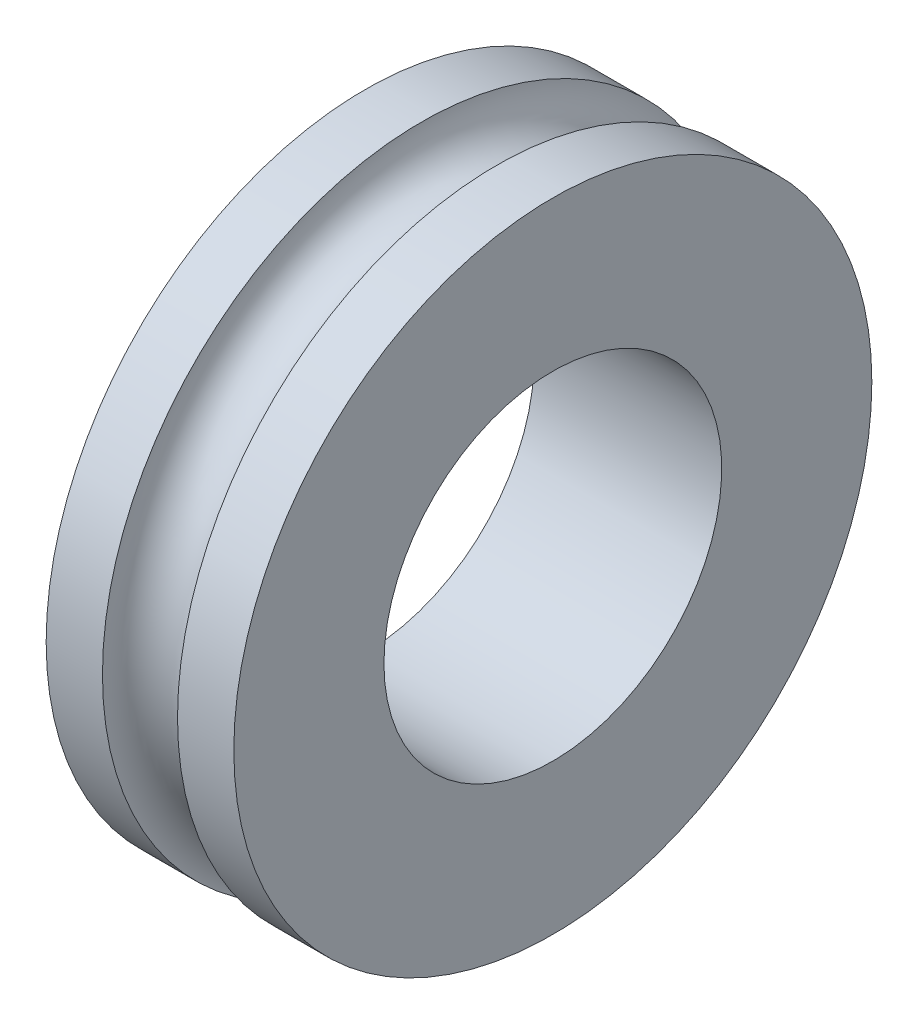
ISO-10303-21;
HEADER;
FILE_DESCRIPTION(('STEP AP214'),'2;1');
FILE_NAME('part.step','',(''),(''),'','','');
FILE_SCHEMA(('AUTOMOTIVE_DESIGN { 1 0 10303 214 1 1 1 1 }'));
ENDSEC;
DATA;
#1=APPLICATION_CONTEXT('core data for automotive mechanical design processes');
#2=APPLICATION_PROTOCOL_DEFINITION('international standard','automotive_design',2000,#1);
#3=PRODUCT_CONTEXT('',#1,'mechanical');
#4=PRODUCT('Part','Part','',(#3));
#5=PRODUCT_RELATED_PRODUCT_CATEGORY('part','',(#4));
#6=PRODUCT_DEFINITION_FORMATION('','',#4);
#7=PRODUCT_DEFINITION_CONTEXT('part definition',#1,'design');
#8=PRODUCT_DEFINITION('design','',#6,#7);
#9=PRODUCT_DEFINITION_SHAPE('','',#8);
#10=(LENGTH_UNIT() NAMED_UNIT(*) SI_UNIT(.MILLI.,.METRE.));
#11=(NAMED_UNIT(*) PLANE_ANGLE_UNIT() SI_UNIT($,.RADIAN.));
#12=(NAMED_UNIT(*) SI_UNIT($,.STERADIAN.) SOLID_ANGLE_UNIT());
#13=UNCERTAINTY_MEASURE_WITH_UNIT(LENGTH_MEASURE(1.E-05),#10,'distance_accuracy_value','');
#14=(GEOMETRIC_REPRESENTATION_CONTEXT(3) GLOBAL_UNCERTAINTY_ASSIGNED_CONTEXT((#13)) GLOBAL_UNIT_ASSIGNED_CONTEXT((#10,
#11,#12)) REPRESENTATION_CONTEXT('',''));
#15=CARTESIAN_POINT('',(0.,0.,0.));
#16=DIRECTION('',(0.,0.,1.));
#17=DIRECTION('',(1.,0.,0.));
#18=AXIS2_PLACEMENT_3D('',#15,#16,#17);
#19=CARTESIAN_POINT('',(2.5,8.5,0.));
#20=DIRECTION('',(-1.,0.,0.));
#21=DIRECTION('',(0.,0.,1.));
#22=AXIS2_PLACEMENT_3D('',#19,#20,#21);
#23=PLANE('',#22);
#24=CARTESIAN_POINT('',(2.5,0.,0.));
#25=DIRECTION('',(-1.,0.,0.));
#26=DIRECTION('',(0.,0.,1.));
#27=AXIS2_PLACEMENT_3D('',#24,#25,#26);
#28=CIRCLE('',#27,8.5);
#29=CARTESIAN_POINT('',(2.5,0.,8.5));
#30=VERTEX_POINT('',#29);
#31=EDGE_CURVE('E10',#30,#30,#28,.T.);
#32=ORIENTED_EDGE('',*,*,#31,.F.);
#33=EDGE_LOOP('',(#32));
#34=FACE_BOUND('',#33,.T.);
#35=CARTESIAN_POINT('',(2.5,0.,0.));
#36=DIRECTION('',(-1.,0.,0.));
#37=DIRECTION('',(0.,0.,1.));
#38=AXIS2_PLACEMENT_3D('',#35,#36,#37);
#39=CIRCLE('',#38,4.5);
#40=CARTESIAN_POINT('',(2.5,0.,4.5));
#41=VERTEX_POINT('',#40);
#42=EDGE_CURVE('E54',#41,#41,#39,.T.);
#43=ORIENTED_EDGE('',*,*,#42,.T.);
#44=EDGE_LOOP('',(#43));
#45=FACE_BOUND('',#44,.T.);
#46=ADVANCED_FACE('F32',(#34,#45),#23,.F.);
#47=CARTESIAN_POINT('',(0.,0.,0.));
#48=DIRECTION('',(-1.,0.,0.));
#49=DIRECTION('',(0.,0.,1.));
#50=AXIS2_PLACEMENT_3D('',#47,#48,#49);
#51=CYLINDRICAL_SURFACE('',#50,8.5);
#52=CARTESIAN_POINT('',(0.999999999999998,0.,0.));
#53=DIRECTION('',(-1.,0.,0.));
#54=DIRECTION('',(0.,0.,1.));
#55=AXIS2_PLACEMENT_3D('',#52,#53,#54);
#56=CIRCLE('',#55,8.49999999999999);
#57=CARTESIAN_POINT('',(0.999999999999998,0.,8.49999999999999));
#58=VERTEX_POINT('',#57);
#59=EDGE_CURVE('E38',#58,#58,#56,.T.);
#60=ORIENTED_EDGE('',*,*,#59,.F.);
#61=EDGE_LOOP('',(#60));
#62=FACE_BOUND('',#61,.T.);
#63=ORIENTED_EDGE('',*,*,#31,.T.);
#64=EDGE_LOOP('',(#63));
#65=FACE_BOUND('',#64,.T.);
#66=ADVANCED_FACE('F79',(#62,#65),#51,.T.);
#67=CARTESIAN_POINT('',(0.,0.,0.));
#68=DIRECTION('',(-1.,0.,0.));
#69=DIRECTION('',(0.,0.,1.));
#70=AXIS2_PLACEMENT_3D('',#67,#68,#69);
#71=TOROIDAL_SURFACE('',#70,8.49999999999999,1.);
#72=CARTESIAN_POINT('',(-1.,0.,0.));
#73=DIRECTION('',(-1.,0.,0.));
#74=DIRECTION('',(0.,0.,1.));
#75=AXIS2_PLACEMENT_3D('',#72,#73,#74);
#76=CIRCLE('',#75,8.5);
#77=CARTESIAN_POINT('',(-1.,0.,8.5));
#78=VERTEX_POINT('',#77);
#79=EDGE_CURVE('E42',#78,#78,#76,.T.);
#80=ORIENTED_EDGE('',*,*,#79,.F.);
#81=EDGE_LOOP('',(#80));
#82=FACE_BOUND('',#81,.T.);
#83=ORIENTED_EDGE('',*,*,#59,.T.);
#84=EDGE_LOOP('',(#83));
#85=FACE_BOUND('',#84,.T.);
#86=ADVANCED_FACE('F74',(#82,#85),#71,.F.);
#87=CARTESIAN_POINT('',(0.,0.,0.));
#88=DIRECTION('',(-1.,0.,0.));
#89=DIRECTION('',(0.,0.,1.));
#90=AXIS2_PLACEMENT_3D('',#87,#88,#89);
#91=CYLINDRICAL_SURFACE('',#90,8.5);
#92=CARTESIAN_POINT('',(-2.5,0.,0.));
#93=DIRECTION('',(-1.,0.,0.));
#94=DIRECTION('',(0.,0.,1.));
#95=AXIS2_PLACEMENT_3D('',#92,#93,#94);
#96=CIRCLE('',#95,8.5);
#97=CARTESIAN_POINT('',(-2.5,0.,8.5));
#98=VERTEX_POINT('',#97);
#99=EDGE_CURVE('E46',#98,#98,#96,.T.);
#100=ORIENTED_EDGE('',*,*,#99,.F.);
#101=EDGE_LOOP('',(#100));
#102=FACE_BOUND('',#101,.T.);
#103=ORIENTED_EDGE('',*,*,#79,.T.);
#104=EDGE_LOOP('',(#103));
#105=FACE_BOUND('',#104,.T.);
#106=ADVANCED_FACE('F68',(#102,#105),#91,.T.);
#107=CARTESIAN_POINT('',(-2.5,8.5,0.));
#108=DIRECTION('',(1.,0.,0.));
#109=DIRECTION('',(0.,0.,-1.));
#110=AXIS2_PLACEMENT_3D('',#107,#108,#109);
#111=PLANE('',#110);
#112=CARTESIAN_POINT('',(-2.5,0.,0.));
#113=DIRECTION('',(-1.,0.,0.));
#114=DIRECTION('',(0.,0.,1.));
#115=AXIS2_PLACEMENT_3D('',#112,#113,#114);
#116=CIRCLE('',#115,4.5);
#117=CARTESIAN_POINT('',(-2.5,0.,4.5));
#118=VERTEX_POINT('',#117);
#119=EDGE_CURVE('E51',#118,#118,#116,.T.);
#120=ORIENTED_EDGE('',*,*,#119,.F.);
#121=EDGE_LOOP('',(#120));
#122=FACE_BOUND('',#121,.T.);
#123=ORIENTED_EDGE('',*,*,#99,.T.);
#124=EDGE_LOOP('',(#123));
#125=FACE_BOUND('',#124,.T.);
#126=ADVANCED_FACE('F62',(#122,#125),#111,.F.);
#127=CARTESIAN_POINT('',(0.,0.,0.));
#128=DIRECTION('',(-1.,0.,0.));
#129=DIRECTION('',(0.,0.,1.));
#130=AXIS2_PLACEMENT_3D('',#127,#128,#129);
#131=CYLINDRICAL_SURFACE('',#130,4.5);
#132=ORIENTED_EDGE('',*,*,#42,.F.);
#133=EDGE_LOOP('',(#132));
#134=FACE_BOUND('',#133,.T.);
#135=ORIENTED_EDGE('',*,*,#119,.T.);
#136=EDGE_LOOP('',(#135));
#137=FACE_BOUND('',#136,.T.);
#138=ADVANCED_FACE('F59',(#134,#137),#131,.F.);
#139=CLOSED_SHELL('',(#46,#66,#86,#106,#126,#138));
#140=MANIFOLD_SOLID_BREP('B2',#139);
#141=ADVANCED_BREP_SHAPE_REPRESENTATION('',(#18,#140),#14);
#142=SHAPE_DEFINITION_REPRESENTATION(#9,#141);
ENDSEC;
END-ISO-10303-21;
